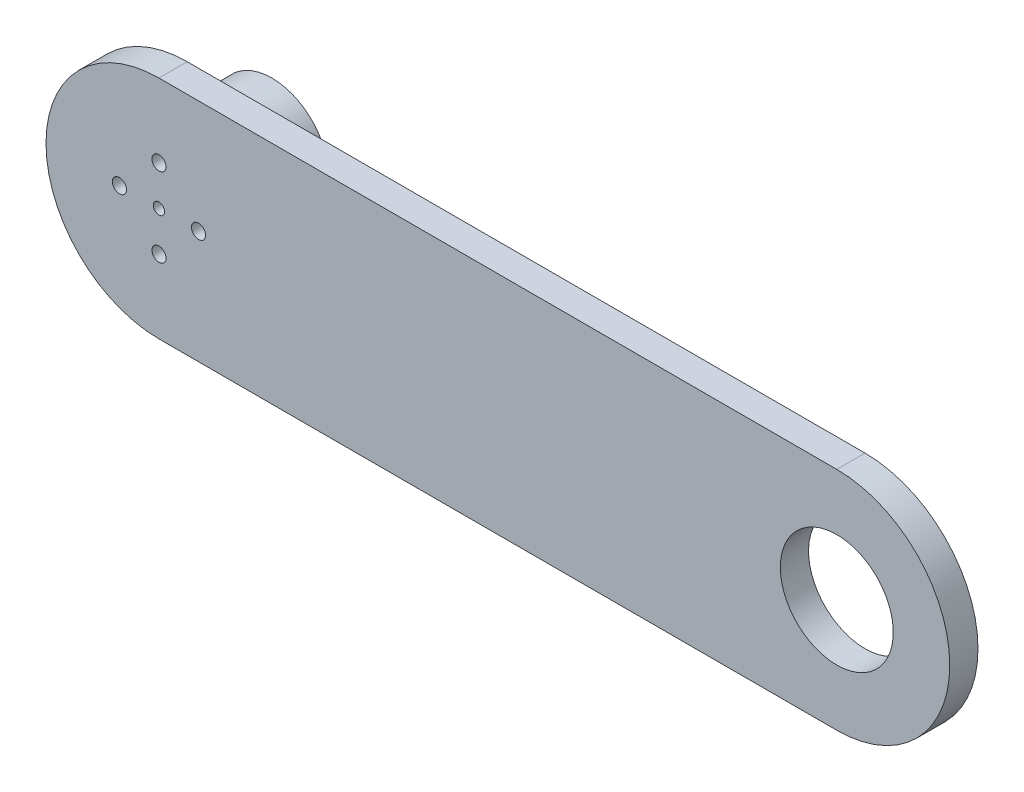
ISO-10303-21;
HEADER;
FILE_DESCRIPTION(('STEP AP214'),'2;1');
FILE_NAME('part.step','',(''),(''),'','','');
FILE_SCHEMA(('AUTOMOTIVE_DESIGN { 1 0 10303 214 1 1 1 1 }'));
ENDSEC;
DATA;
#1=APPLICATION_CONTEXT('core data for automotive mechanical design processes');
#2=APPLICATION_PROTOCOL_DEFINITION('international standard','automotive_design',2000,#1);
#3=PRODUCT_CONTEXT('',#1,'mechanical');
#4=PRODUCT('Part','Part','',(#3));
#5=PRODUCT_RELATED_PRODUCT_CATEGORY('part','',(#4));
#6=PRODUCT_DEFINITION_FORMATION('','',#4);
#7=PRODUCT_DEFINITION_CONTEXT('part definition',#1,'design');
#8=PRODUCT_DEFINITION('design','',#6,#7);
#9=PRODUCT_DEFINITION_SHAPE('','',#8);
#10=(LENGTH_UNIT() NAMED_UNIT(*) SI_UNIT(.MILLI.,.METRE.));
#11=(NAMED_UNIT(*) PLANE_ANGLE_UNIT() SI_UNIT($,.RADIAN.));
#12=(NAMED_UNIT(*) SI_UNIT($,.STERADIAN.) SOLID_ANGLE_UNIT());
#13=UNCERTAINTY_MEASURE_WITH_UNIT(LENGTH_MEASURE(1.E-05),#10,'distance_accuracy_value','');
#14=(GEOMETRIC_REPRESENTATION_CONTEXT(3) GLOBAL_UNCERTAINTY_ASSIGNED_CONTEXT((#13)) GLOBAL_UNIT_ASSIGNED_CONTEXT((#10,
#11,#12)) REPRESENTATION_CONTEXT('',''));
#15=CARTESIAN_POINT('',(0.,0.,0.));
#16=DIRECTION('',(0.,0.,1.));
#17=DIRECTION('',(1.,0.,0.));
#18=AXIS2_PLACEMENT_3D('',#15,#16,#17);
#19=CARTESIAN_POINT('',(0.,0.,0.));
#20=DIRECTION('',(0.,0.,-1.));
#21=DIRECTION('',(0.,1.,0.));
#22=AXIS2_PLACEMENT_3D('',#19,#20,#21);
#23=CYLINDRICAL_SURFACE('',#22,20.);
#24=CARTESIAN_POINT('',(0.,0.,-5.));
#25=DIRECTION('',(0.,0.,1.));
#26=DIRECTION('',(0.,-1.,0.));
#27=AXIS2_PLACEMENT_3D('',#24,#25,#26);
#28=CIRCLE('',#27,20.);
#29=CARTESIAN_POINT('',(0.,20.,-4.99999999999993));
#30=VERTEX_POINT('',#29);
#31=CARTESIAN_POINT('',(0.,-20.,-5.00000000000007));
#32=VERTEX_POINT('',#31);
#33=EDGE_CURVE('E104',#30,#32,#28,.T.);
#34=ORIENTED_EDGE('',*,*,#33,.T.);
#35=DIRECTION('',(0.,0.,-1.));
#36=VECTOR('',#35,1.);
#37=CARTESIAN_POINT('',(0.,-20.,0.));
#38=LINE('',#37,#36);
#39=CARTESIAN_POINT('',(0.,-20.,0.));
#40=VERTEX_POINT('',#39);
#41=EDGE_CURVE('E44',#40,#32,#38,.T.);
#42=ORIENTED_EDGE('',*,*,#41,.F.);
#43=CARTESIAN_POINT('',(0.,0.,0.));
#44=DIRECTION('',(0.,0.,1.));
#45=DIRECTION('',(0.,-1.,0.));
#46=AXIS2_PLACEMENT_3D('',#43,#44,#45);
#47=CIRCLE('',#46,20.);
#48=CARTESIAN_POINT('',(0.,20.,0.));
#49=VERTEX_POINT('',#48);
#50=EDGE_CURVE('E78',#49,#40,#47,.T.);
#51=ORIENTED_EDGE('',*,*,#50,.F.);
#52=DIRECTION('',(0.,0.,-1.));
#53=VECTOR('',#52,1.);
#54=CARTESIAN_POINT('',(0.,20.,0.));
#55=LINE('',#54,#53);
#56=EDGE_CURVE('E52',#49,#30,#55,.T.);
#57=ORIENTED_EDGE('',*,*,#56,.T.);
#58=EDGE_LOOP('',(#34,#42,#51,#57));
#59=FACE_BOUND('',#58,.T.);
#60=ADVANCED_FACE('F36',(#59),#23,.T.);
#61=CARTESIAN_POINT('',(120.,-20.,0.));
#62=DIRECTION('',(0.,-1.,0.));
#63=DIRECTION('',(1.,0.,0.));
#64=AXIS2_PLACEMENT_3D('',#61,#62,#63);
#65=PLANE('',#64);
#66=DIRECTION('',(-1.,0.,0.));
#67=VECTOR('',#66,1.);
#68=CARTESIAN_POINT('',(120.,-20.,-5.00000000000007));
#69=LINE('',#68,#67);
#70=CARTESIAN_POINT('',(120.,-20.,-5.00000000000007));
#71=VERTEX_POINT('',#70);
#72=EDGE_CURVE('E89',#71,#32,#69,.T.);
#73=ORIENTED_EDGE('',*,*,#72,.F.);
#74=DIRECTION('',(0.,0.,-1.));
#75=VECTOR('',#74,1.);
#76=CARTESIAN_POINT('',(120.,-20.,0.));
#77=LINE('',#76,#75);
#78=CARTESIAN_POINT('',(120.,-20.,0.));
#79=VERTEX_POINT('',#78);
#80=EDGE_CURVE('E84',#79,#71,#77,.T.);
#81=ORIENTED_EDGE('',*,*,#80,.F.);
#82=DIRECTION('',(-1.,0.,0.));
#83=VECTOR('',#82,1.);
#84=CARTESIAN_POINT('',(120.,-20.,0.));
#85=LINE('',#84,#83);
#86=EDGE_CURVE('E87',#79,#40,#85,.T.);
#87=ORIENTED_EDGE('',*,*,#86,.T.);
#88=ORIENTED_EDGE('',*,*,#41,.T.);
#89=EDGE_LOOP('',(#73,#81,#87,#88));
#90=FACE_BOUND('',#89,.T.);
#91=ADVANCED_FACE('F86',(#90),#65,.T.);
#92=CARTESIAN_POINT('',(120.,0.,0.));
#93=DIRECTION('',(0.,0.,-1.));
#94=DIRECTION('',(0.,1.,0.));
#95=AXIS2_PLACEMENT_3D('',#92,#93,#94);
#96=CYLINDRICAL_SURFACE('',#95,20.);
#97=CARTESIAN_POINT('',(120.,0.,-5.));
#98=DIRECTION('',(0.,0.,1.));
#99=DIRECTION('',(0.,-1.,0.));
#100=AXIS2_PLACEMENT_3D('',#97,#98,#99);
#101=CIRCLE('',#100,20.);
#102=CARTESIAN_POINT('',(120.,20.,-4.99999999999993));
#103=VERTEX_POINT('',#102);
#104=EDGE_CURVE('E108',#71,#103,#101,.T.);
#105=ORIENTED_EDGE('',*,*,#104,.T.);
#106=DIRECTION('',(0.,0.,-1.));
#107=VECTOR('',#106,1.);
#108=CARTESIAN_POINT('',(120.,20.,0.));
#109=LINE('',#108,#107);
#110=CARTESIAN_POINT('',(120.,20.,0.));
#111=VERTEX_POINT('',#110);
#112=EDGE_CURVE('E67',#111,#103,#109,.T.);
#113=ORIENTED_EDGE('',*,*,#112,.F.);
#114=CARTESIAN_POINT('',(120.,0.,0.));
#115=DIRECTION('',(0.,0.,1.));
#116=DIRECTION('',(0.,-1.,0.));
#117=AXIS2_PLACEMENT_3D('',#114,#115,#116);
#118=CIRCLE('',#117,20.);
#119=EDGE_CURVE('E93',#79,#111,#118,.T.);
#120=ORIENTED_EDGE('',*,*,#119,.F.);
#121=ORIENTED_EDGE('',*,*,#80,.T.);
#122=EDGE_LOOP('',(#105,#113,#120,#121));
#123=FACE_BOUND('',#122,.T.);
#124=ADVANCED_FACE('F94',(#123),#96,.T.);
#125=CARTESIAN_POINT('',(0.,20.,0.));
#126=DIRECTION('',(0.,1.,0.));
#127=DIRECTION('',(-1.,0.,0.));
#128=AXIS2_PLACEMENT_3D('',#125,#126,#127);
#129=PLANE('',#128);
#130=DIRECTION('',(1.,0.,0.));
#131=VECTOR('',#130,1.);
#132=CARTESIAN_POINT('',(0.,20.,-4.99999999999993));
#133=LINE('',#132,#131);
#134=EDGE_CURVE('E99',#30,#103,#133,.T.);
#135=ORIENTED_EDGE('',*,*,#134,.F.);
#136=ORIENTED_EDGE('',*,*,#56,.F.);
#137=DIRECTION('',(1.,0.,0.));
#138=VECTOR('',#137,1.);
#139=CARTESIAN_POINT('',(0.,20.,0.));
#140=LINE('',#139,#138);
#141=EDGE_CURVE('E95',#49,#111,#140,.T.);
#142=ORIENTED_EDGE('',*,*,#141,.T.);
#143=ORIENTED_EDGE('',*,*,#112,.T.);
#144=EDGE_LOOP('',(#135,#136,#142,#143));
#145=FACE_BOUND('',#144,.T.);
#146=ADVANCED_FACE('F115',(#145),#129,.T.);
#147=CARTESIAN_POINT('',(0.,0.,0.));
#148=DIRECTION('',(0.,0.,1.));
#149=DIRECTION('',(0.,-1.,0.));
#150=AXIS2_PLACEMENT_3D('',#147,#148,#149);
#151=PLANE('',#150);
#152=CARTESIAN_POINT('',(120.,0.,0.));
#153=DIRECTION('',(0.,0.,1.));
#154=DIRECTION('',(0.,-1.,0.));
#155=AXIS2_PLACEMENT_3D('',#152,#153,#154);
#156=CIRCLE('',#155,9.99999999999998);
#157=CARTESIAN_POINT('',(120.,-10.,0.));
#158=VERTEX_POINT('',#157);
#159=EDGE_CURVE('E305',#158,#158,#156,.T.);
#160=ORIENTED_EDGE('',*,*,#159,.F.);
#161=EDGE_LOOP('',(#160));
#162=FACE_BOUND('',#161,.T.);
#163=CARTESIAN_POINT('',(0.,6.99999999999998,0.));
#164=DIRECTION('',(0.,0.,1.));
#165=DIRECTION('',(0.,-1.,0.));
#166=AXIS2_PLACEMENT_3D('',#163,#164,#165);
#167=CIRCLE('',#166,1.25);
#168=CARTESIAN_POINT('',(0.,5.74999999999998,0.));
#169=VERTEX_POINT('',#168);
#170=EDGE_CURVE('E106',#169,#169,#167,.T.);
#171=ORIENTED_EDGE('',*,*,#170,.F.);
#172=EDGE_LOOP('',(#171));
#173=FACE_BOUND('',#172,.T.);
#174=CARTESIAN_POINT('',(-6.999,-0.00100000000001874,0.));
#175=DIRECTION('',(0.,0.,1.));
#176=DIRECTION('',(0.,-1.,0.));
#177=AXIS2_PLACEMENT_3D('',#174,#175,#176);
#178=CIRCLE('',#177,1.25);
#179=CARTESIAN_POINT('',(-6.999,-1.25100000000002,0.));
#180=VERTEX_POINT('',#179);
#181=EDGE_CURVE('E311',#180,#180,#178,.T.);
#182=ORIENTED_EDGE('',*,*,#181,.F.);
#183=EDGE_LOOP('',(#182));
#184=FACE_BOUND('',#183,.T.);
#185=CARTESIAN_POINT('',(0.00200000000000086,-7.00000000000002,0.));
#186=DIRECTION('',(0.,0.,1.));
#187=DIRECTION('',(0.,-1.,0.));
#188=AXIS2_PLACEMENT_3D('',#185,#186,#187);
#189=CIRCLE('',#188,1.25);
#190=CARTESIAN_POINT('',(0.00200000000000086,-8.25000000000002,0.));
#191=VERTEX_POINT('',#190);
#192=EDGE_CURVE('E315',#191,#191,#189,.T.);
#193=ORIENTED_EDGE('',*,*,#192,.F.);
#194=EDGE_LOOP('',(#193));
#195=FACE_BOUND('',#194,.T.);
#196=CARTESIAN_POINT('',(7.001,0.000999999999982971,0.));
#197=DIRECTION('',(0.,0.,1.));
#198=DIRECTION('',(0.,-1.,0.));
#199=AXIS2_PLACEMENT_3D('',#196,#197,#198);
#200=CIRCLE('',#199,1.25);
#201=CARTESIAN_POINT('',(7.001,-1.24900000000002,0.));
#202=VERTEX_POINT('',#201);
#203=EDGE_CURVE('E318',#202,#202,#200,.T.);
#204=ORIENTED_EDGE('',*,*,#203,.F.);
#205=EDGE_LOOP('',(#204));
#206=FACE_BOUND('',#205,.T.);
#207=CARTESIAN_POINT('',(0.,0.,0.));
#208=DIRECTION('',(0.,0.,1.));
#209=DIRECTION('',(0.,-1.,0.));
#210=AXIS2_PLACEMENT_3D('',#207,#208,#209);
#211=CIRCLE('',#210,1.);
#212=CARTESIAN_POINT('',(0.,-1.00000000000002,0.));
#213=VERTEX_POINT('',#212);
#214=EDGE_CURVE('E314',#213,#213,#211,.T.);
#215=ORIENTED_EDGE('',*,*,#214,.F.);
#216=EDGE_LOOP('',(#215));
#217=FACE_BOUND('',#216,.T.);
#218=ORIENTED_EDGE('',*,*,#50,.T.);
#219=ORIENTED_EDGE('',*,*,#86,.F.);
#220=ORIENTED_EDGE('',*,*,#119,.T.);
#221=ORIENTED_EDGE('',*,*,#141,.F.);
#222=EDGE_LOOP('',(#218,#219,#220,#221));
#223=FACE_BOUND('',#222,.T.);
#224=ADVANCED_FACE('F97',(#162,#173,#184,#195,#206,#217,#223),#151,.T.);
#225=CARTESIAN_POINT('',(0.,0.,-5.));
#226=DIRECTION('',(0.,0.,1.));
#227=DIRECTION('',(0.,-1.,0.));
#228=AXIS2_PLACEMENT_3D('',#225,#226,#227);
#229=PLANE('',#228);
#230=CARTESIAN_POINT('',(0.,0.,-5.));
#231=DIRECTION('',(0.,0.,1.));
#232=DIRECTION('',(0.,-1.,0.));
#233=AXIS2_PLACEMENT_3D('',#230,#231,#232);
#234=CIRCLE('',#233,10.);
#235=CARTESIAN_POINT('',(0.,-10.,-5.00000000000003));
#236=VERTEX_POINT('',#235);
#237=EDGE_CURVE('E11',#236,#236,#234,.F.);
#238=ORIENTED_EDGE('',*,*,#237,.F.);
#239=EDGE_LOOP('',(#238));
#240=FACE_BOUND('',#239,.T.);
#241=CARTESIAN_POINT('',(120.,0.,-5.));
#242=DIRECTION('',(0.,0.,1.));
#243=DIRECTION('',(0.,-1.,0.));
#244=AXIS2_PLACEMENT_3D('',#241,#242,#243);
#245=CIRCLE('',#244,9.99999999999998);
#246=CARTESIAN_POINT('',(120.,-9.99999999999998,-5.00000000000003));
#247=VERTEX_POINT('',#246);
#248=EDGE_CURVE('E308',#247,#247,#245,.F.);
#249=ORIENTED_EDGE('',*,*,#248,.F.);
#250=EDGE_LOOP('',(#249));
#251=FACE_BOUND('',#250,.T.);
#252=ORIENTED_EDGE('',*,*,#33,.F.);
#253=ORIENTED_EDGE('',*,*,#134,.T.);
#254=ORIENTED_EDGE('',*,*,#104,.F.);
#255=ORIENTED_EDGE('',*,*,#72,.T.);
#256=EDGE_LOOP('',(#252,#253,#254,#255));
#257=FACE_BOUND('',#256,.T.);
#258=ADVANCED_FACE('F114',(#240,#251,#257),#229,.F.);
#259=CARTESIAN_POINT('',(0.,0.,-5.001));
#260=DIRECTION('',(0.,0.,1.));
#261=DIRECTION('',(0.,-1.,0.));
#262=AXIS2_PLACEMENT_3D('',#259,#260,#261);
#263=CYLINDRICAL_SURFACE('',#262,1.);
#264=ORIENTED_EDGE('',*,*,#214,.T.);
#265=EDGE_LOOP('',(#264));
#266=FACE_BOUND('',#265,.T.);
#267=CARTESIAN_POINT('',(0.,0.,-5.));
#268=DIRECTION('',(0.,0.,-1.));
#269=DIRECTION('',(0.,1.,0.));
#270=AXIS2_PLACEMENT_3D('',#267,#268,#269);
#271=CIRCLE('',#270,1.);
#272=CARTESIAN_POINT('',(0.,1.,-5.));
#273=VERTEX_POINT('',#272);
#274=EDGE_CURVE('E302',#273,#273,#271,.F.);
#275=ORIENTED_EDGE('',*,*,#274,.F.);
#276=EDGE_LOOP('',(#275));
#277=FACE_BOUND('',#276,.T.);
#278=ADVANCED_FACE('F156',(#266,#277),#263,.F.);
#279=CARTESIAN_POINT('',(7.001,0.00100000000000043,-5.001));
#280=DIRECTION('',(0.,0.,1.));
#281=DIRECTION('',(0.,-1.,0.));
#282=AXIS2_PLACEMENT_3D('',#279,#280,#281);
#283=CYLINDRICAL_SURFACE('',#282,1.25);
#284=ORIENTED_EDGE('',*,*,#203,.T.);
#285=EDGE_LOOP('',(#284));
#286=FACE_BOUND('',#285,.T.);
#287=CARTESIAN_POINT('',(7.001,0.00100000000000043,-5.));
#288=DIRECTION('',(0.,0.,-1.));
#289=DIRECTION('',(0.,1.,0.));
#290=AXIS2_PLACEMENT_3D('',#287,#288,#289);
#291=CIRCLE('',#290,1.25);
#292=CARTESIAN_POINT('',(7.001,1.251,-5.));
#293=VERTEX_POINT('',#292);
#294=EDGE_CURVE('E299',#293,#293,#291,.F.);
#295=ORIENTED_EDGE('',*,*,#294,.F.);
#296=EDGE_LOOP('',(#295));
#297=FACE_BOUND('',#296,.T.);
#298=ADVANCED_FACE('F167',(#286,#297),#283,.F.);
#299=CARTESIAN_POINT('',(0.00200000000000086,-7.,-5.00100000000002));
#300=DIRECTION('',(0.,0.,1.));
#301=DIRECTION('',(0.,-1.,0.));
#302=AXIS2_PLACEMENT_3D('',#299,#300,#301);
#303=CYLINDRICAL_SURFACE('',#302,1.25);
#304=ORIENTED_EDGE('',*,*,#192,.T.);
#305=EDGE_LOOP('',(#304));
#306=FACE_BOUND('',#305,.T.);
#307=CARTESIAN_POINT('',(0.00200000000000086,-7.,-5.00000000000002));
#308=DIRECTION('',(0.,0.,-1.));
#309=DIRECTION('',(0.,1.,0.));
#310=AXIS2_PLACEMENT_3D('',#307,#308,#309);
#311=CIRCLE('',#310,1.25);
#312=CARTESIAN_POINT('',(0.00200000000000086,-5.75,-5.00000000000002));
#313=VERTEX_POINT('',#312);
#314=EDGE_CURVE('E296',#313,#313,#311,.F.);
#315=ORIENTED_EDGE('',*,*,#314,.F.);
#316=EDGE_LOOP('',(#315));
#317=FACE_BOUND('',#316,.T.);
#318=ADVANCED_FACE('F177',(#306,#317),#303,.F.);
#319=CARTESIAN_POINT('',(-6.999,-0.00100000000000128,-5.001));
#320=DIRECTION('',(0.,0.,1.));
#321=DIRECTION('',(0.,-1.,0.));
#322=AXIS2_PLACEMENT_3D('',#319,#320,#321);
#323=CYLINDRICAL_SURFACE('',#322,1.25);
#324=ORIENTED_EDGE('',*,*,#181,.T.);
#325=EDGE_LOOP('',(#324));
#326=FACE_BOUND('',#325,.T.);
#327=CARTESIAN_POINT('',(-6.999,-0.00100000000000129,-5.));
#328=DIRECTION('',(0.,0.,-1.));
#329=DIRECTION('',(0.,1.,0.));
#330=AXIS2_PLACEMENT_3D('',#327,#328,#329);
#331=CIRCLE('',#330,1.25);
#332=CARTESIAN_POINT('',(-6.999,1.249,-5.));
#333=VERTEX_POINT('',#332);
#334=EDGE_CURVE('E291',#333,#333,#331,.F.);
#335=ORIENTED_EDGE('',*,*,#334,.F.);
#336=EDGE_LOOP('',(#335));
#337=FACE_BOUND('',#336,.T.);
#338=ADVANCED_FACE('F187',(#326,#337),#323,.F.);
#339=CARTESIAN_POINT('',(0.,7.,-5.00099999999998));
#340=DIRECTION('',(0.,0.,1.));
#341=DIRECTION('',(0.,-1.,0.));
#342=AXIS2_PLACEMENT_3D('',#339,#340,#341);
#343=CYLINDRICAL_SURFACE('',#342,1.25);
#344=ORIENTED_EDGE('',*,*,#170,.T.);
#345=EDGE_LOOP('',(#344));
#346=FACE_BOUND('',#345,.T.);
#347=CARTESIAN_POINT('',(0.,7.,-4.99999999999998));
#348=DIRECTION('',(0.,0.,-1.));
#349=DIRECTION('',(0.,1.,0.));
#350=AXIS2_PLACEMENT_3D('',#347,#348,#349);
#351=CIRCLE('',#350,1.25);
#352=CARTESIAN_POINT('',(0.,8.25,-4.99999999999997));
#353=VERTEX_POINT('',#352);
#354=EDGE_CURVE('E288',#353,#353,#351,.F.);
#355=ORIENTED_EDGE('',*,*,#354,.F.);
#356=EDGE_LOOP('',(#355));
#357=FACE_BOUND('',#356,.T.);
#358=ADVANCED_FACE('F197',(#346,#357),#343,.F.);
#359=CARTESIAN_POINT('',(120.,0.,-5.001));
#360=DIRECTION('',(0.,0.,1.));
#361=DIRECTION('',(0.,-1.,0.));
#362=AXIS2_PLACEMENT_3D('',#359,#360,#361);
#363=CYLINDRICAL_SURFACE('',#362,9.99999999999998);
#364=ORIENTED_EDGE('',*,*,#159,.T.);
#365=EDGE_LOOP('',(#364));
#366=FACE_BOUND('',#365,.T.);
#367=ORIENTED_EDGE('',*,*,#248,.T.);
#368=EDGE_LOOP('',(#367));
#369=FACE_BOUND('',#368,.T.);
#370=ADVANCED_FACE('F207',(#366,#369),#363,.F.);
#371=CARTESIAN_POINT('',(0.,0.,-5.));
#372=DIRECTION('',(0.,0.,-1.));
#373=DIRECTION('',(0.,1.,0.));
#374=AXIS2_PLACEMENT_3D('',#371,#372,#373);
#375=PLANE('',#374);
#376=ORIENTED_EDGE('',*,*,#354,.T.);
#377=EDGE_LOOP('',(#376));
#378=FACE_BOUND('',#377,.T.);
#379=ADVANCED_FACE('F216',(#378),#375,.F.);
#380=ORIENTED_EDGE('',*,*,#334,.T.);
#381=EDGE_LOOP('',(#380));
#382=FACE_BOUND('',#381,.T.);
#383=ADVANCED_FACE('F225',(#382),#375,.F.);
#384=ORIENTED_EDGE('',*,*,#314,.T.);
#385=EDGE_LOOP('',(#384));
#386=FACE_BOUND('',#385,.T.);
#387=ADVANCED_FACE('F236',(#386),#375,.F.);
#388=ORIENTED_EDGE('',*,*,#294,.T.);
#389=EDGE_LOOP('',(#388));
#390=FACE_BOUND('',#389,.T.);
#391=ADVANCED_FACE('F245',(#390),#375,.F.);
#392=ORIENTED_EDGE('',*,*,#274,.T.);
#393=EDGE_LOOP('',(#392));
#394=FACE_BOUND('',#393,.T.);
#395=ADVANCED_FACE('F228',(#394),#375,.F.);
#396=CARTESIAN_POINT('',(0.,0.,-20.));
#397=DIRECTION('',(0.,0.,1.));
#398=DIRECTION('',(0.,-1.,0.));
#399=AXIS2_PLACEMENT_3D('',#396,#397,#398);
#400=CYLINDRICAL_SURFACE('',#399,10.);
#401=CARTESIAN_POINT('',(0.,0.,-20.));
#402=DIRECTION('',(0.,0.,-1.));
#403=DIRECTION('',(0.,1.,0.));
#404=AXIS2_PLACEMENT_3D('',#401,#402,#403);
#405=CIRCLE('',#404,10.);
#406=CARTESIAN_POINT('',(0.,10.0000000000001,-20.));
#407=VERTEX_POINT('',#406);
#408=EDGE_CURVE('E287',#407,#407,#405,.T.);
#409=ORIENTED_EDGE('',*,*,#408,.F.);
#410=EDGE_LOOP('',(#409));
#411=FACE_BOUND('',#410,.T.);
#412=ORIENTED_EDGE('',*,*,#237,.T.);
#413=EDGE_LOOP('',(#412));
#414=FACE_BOUND('',#413,.T.);
#415=ADVANCED_FACE('F262',(#411,#414),#400,.T.);
#416=CARTESIAN_POINT('',(0.,0.,-20.));
#417=DIRECTION('',(0.,0.,-1.));
#418=DIRECTION('',(0.,1.,0.));
#419=AXIS2_PLACEMENT_3D('',#416,#417,#418);
#420=PLANE('',#419);
#421=ORIENTED_EDGE('',*,*,#408,.T.);
#422=EDGE_LOOP('',(#421));
#423=FACE_BOUND('',#422,.T.);
#424=ADVANCED_FACE('F271',(#423),#420,.T.);
#425=CLOSED_SHELL('',(#60,#91,#124,#146,#224,#258,#278,#298,#318,#338,#358,#370,#379,#383,#387,
#391,#395,#415,#424));
#426=MANIFOLD_SOLID_BREP('B2',#425);
#427=ADVANCED_BREP_SHAPE_REPRESENTATION('',(#18,#426),#14);
#428=SHAPE_DEFINITION_REPRESENTATION(#9,#427);
ENDSEC;
END-ISO-10303-21;
